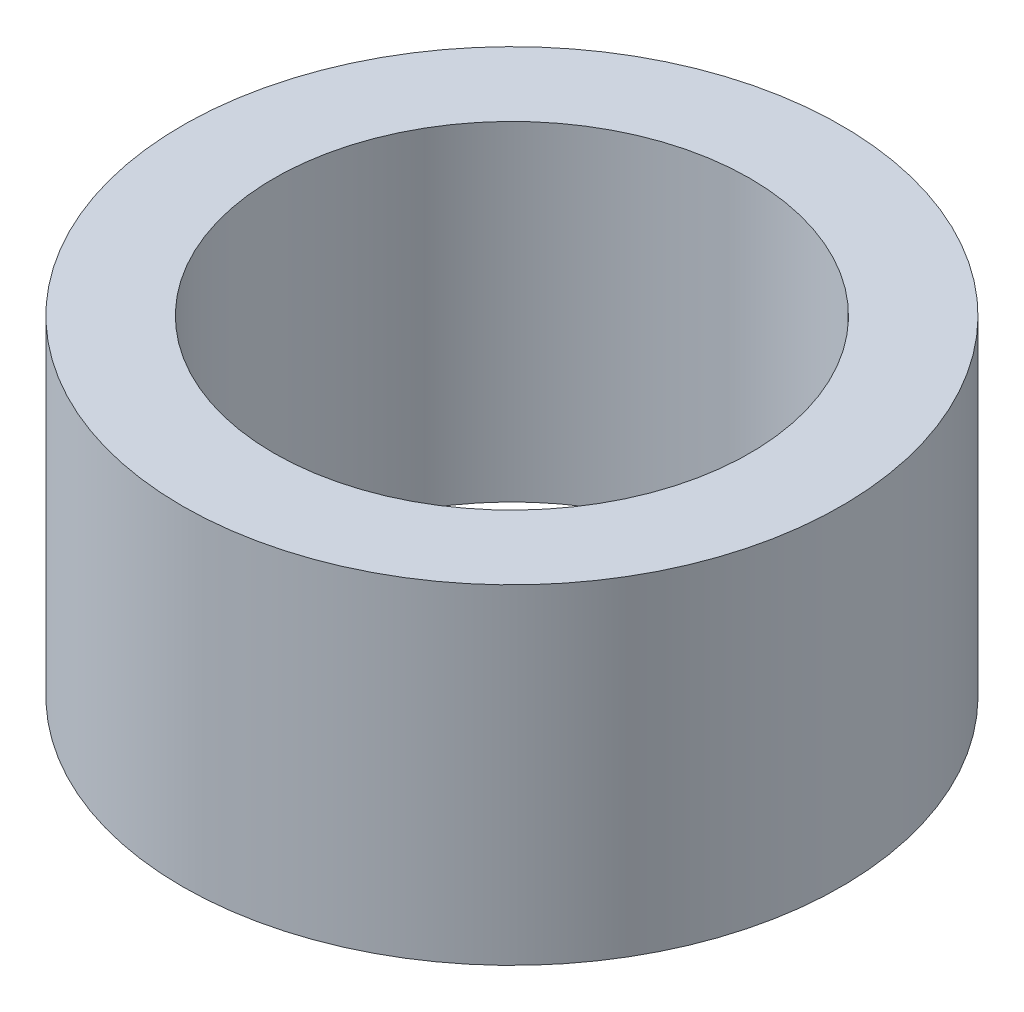
ISO-10303-21;
HEADER;
FILE_DESCRIPTION(('STEP AP214'),'2;1');
FILE_NAME('part.step','',(''),(''),'','','');
FILE_SCHEMA(('AUTOMOTIVE_DESIGN { 1 0 10303 214 1 1 1 1 }'));
ENDSEC;
DATA;
#1=APPLICATION_CONTEXT('core data for automotive mechanical design processes');
#2=APPLICATION_PROTOCOL_DEFINITION('international standard','automotive_design',2000,#1);
#3=PRODUCT_CONTEXT('',#1,'mechanical');
#4=PRODUCT('Part','Part','',(#3));
#5=PRODUCT_RELATED_PRODUCT_CATEGORY('part','',(#4));
#6=PRODUCT_DEFINITION_FORMATION('','',#4);
#7=PRODUCT_DEFINITION_CONTEXT('part definition',#1,'design');
#8=PRODUCT_DEFINITION('design','',#6,#7);
#9=PRODUCT_DEFINITION_SHAPE('','',#8);
#10=(LENGTH_UNIT() NAMED_UNIT(*) SI_UNIT(.MILLI.,.METRE.));
#11=(NAMED_UNIT(*) PLANE_ANGLE_UNIT() SI_UNIT($,.RADIAN.));
#12=(NAMED_UNIT(*) SI_UNIT($,.STERADIAN.) SOLID_ANGLE_UNIT());
#13=UNCERTAINTY_MEASURE_WITH_UNIT(LENGTH_MEASURE(1.E-05),#10,'distance_accuracy_value','');
#14=(GEOMETRIC_REPRESENTATION_CONTEXT(3) GLOBAL_UNCERTAINTY_ASSIGNED_CONTEXT((#13)) GLOBAL_UNIT_ASSIGNED_CONTEXT((#10,
#11,#12)) REPRESENTATION_CONTEXT('',''));
#15=CARTESIAN_POINT('',(0.,0.,0.));
#16=DIRECTION('',(0.,0.,1.));
#17=DIRECTION('',(1.,0.,0.));
#18=AXIS2_PLACEMENT_3D('',#15,#16,#17);
#19=CARTESIAN_POINT('',(0.,4.572,0.));
#20=DIRECTION('',(0.,1.,0.));
#21=DIRECTION('',(0.,0.,1.));
#22=AXIS2_PLACEMENT_3D('',#19,#20,#21);
#23=PLANE('',#22);
#24=CARTESIAN_POINT('',(0.,4.572,0.));
#25=DIRECTION('',(0.,1.,0.));
#26=DIRECTION('',(0.,0.,1.));
#27=AXIS2_PLACEMENT_3D('',#24,#25,#26);
#28=CIRCLE('',#27,4.572);
#29=CARTESIAN_POINT('',(0.,4.572,4.572));
#30=VERTEX_POINT('',#29);
#31=EDGE_CURVE('E10',#30,#30,#28,.T.);
#32=ORIENTED_EDGE('',*,*,#31,.T.);
#33=EDGE_LOOP('',(#32));
#34=FACE_BOUND('',#33,.T.);
#35=CARTESIAN_POINT('',(0.,4.572,0.));
#36=DIRECTION('',(0.,1.,0.));
#37=DIRECTION('',(0.,0.,1.));
#38=AXIS2_PLACEMENT_3D('',#35,#36,#37);
#39=CIRCLE('',#38,3.302);
#40=CARTESIAN_POINT('',(0.,4.572,3.302));
#41=VERTEX_POINT('',#40);
#42=EDGE_CURVE('E52',#41,#41,#39,.T.);
#43=ORIENTED_EDGE('',*,*,#42,.F.);
#44=EDGE_LOOP('',(#43));
#45=FACE_BOUND('',#44,.T.);
#46=ADVANCED_FACE('F41',(#34,#45),#23,.T.);
#47=CARTESIAN_POINT('',(0.,0.,0.));
#48=DIRECTION('',(0.,1.,0.));
#49=DIRECTION('',(0.,0.,1.));
#50=AXIS2_PLACEMENT_3D('',#47,#48,#49);
#51=PLANE('',#50);
#52=CARTESIAN_POINT('',(0.,0.,0.));
#53=DIRECTION('',(0.,1.,0.));
#54=DIRECTION('',(0.,0.,1.));
#55=AXIS2_PLACEMENT_3D('',#52,#53,#54);
#56=CIRCLE('',#55,4.572);
#57=CARTESIAN_POINT('',(0.,0.,4.572));
#58=VERTEX_POINT('',#57);
#59=EDGE_CURVE('E45',#58,#58,#56,.T.);
#60=ORIENTED_EDGE('',*,*,#59,.F.);
#61=EDGE_LOOP('',(#60));
#62=FACE_BOUND('',#61,.T.);
#63=CARTESIAN_POINT('',(0.,0.,0.));
#64=DIRECTION('',(0.,1.,0.));
#65=DIRECTION('',(0.,0.,1.));
#66=AXIS2_PLACEMENT_3D('',#63,#64,#65);
#67=CIRCLE('',#66,3.302);
#68=CARTESIAN_POINT('',(0.,0.,3.302));
#69=VERTEX_POINT('',#68);
#70=EDGE_CURVE('E54',#69,#69,#67,.T.);
#71=ORIENTED_EDGE('',*,*,#70,.T.);
#72=EDGE_LOOP('',(#71));
#73=FACE_BOUND('',#72,.T.);
#74=ADVANCED_FACE('F64',(#62,#73),#51,.F.);
#75=CARTESIAN_POINT('',(0.,4.572,0.));
#76=DIRECTION('',(0.,-1.,0.));
#77=DIRECTION('',(0.,0.,-1.));
#78=AXIS2_PLACEMENT_3D('',#75,#76,#77);
#79=CYLINDRICAL_SURFACE('',#78,4.572);
#80=ORIENTED_EDGE('',*,*,#31,.F.);
#81=EDGE_LOOP('',(#80));
#82=FACE_BOUND('',#81,.T.);
#83=ORIENTED_EDGE('',*,*,#59,.T.);
#84=EDGE_LOOP('',(#83));
#85=FACE_BOUND('',#84,.T.);
#86=ADVANCED_FACE('F43',(#82,#85),#79,.T.);
#87=CARTESIAN_POINT('',(0.,4.572,0.));
#88=DIRECTION('',(0.,-1.,0.));
#89=DIRECTION('',(0.,0.,-1.));
#90=AXIS2_PLACEMENT_3D('',#87,#88,#89);
#91=CYLINDRICAL_SURFACE('',#90,3.302);
#92=ORIENTED_EDGE('',*,*,#42,.T.);
#93=EDGE_LOOP('',(#92));
#94=FACE_BOUND('',#93,.T.);
#95=ORIENTED_EDGE('',*,*,#70,.F.);
#96=EDGE_LOOP('',(#95));
#97=FACE_BOUND('',#96,.T.);
#98=ADVANCED_FACE('F60',(#94,#97),#91,.F.);
#99=CLOSED_SHELL('',(#46,#74,#86,#98));
#100=MANIFOLD_SOLID_BREP('B2',#99);
#101=ADVANCED_BREP_SHAPE_REPRESENTATION('',(#18,#100),#14);
#102=SHAPE_DEFINITION_REPRESENTATION(#9,#101);
ENDSEC;
END-ISO-10303-21;
